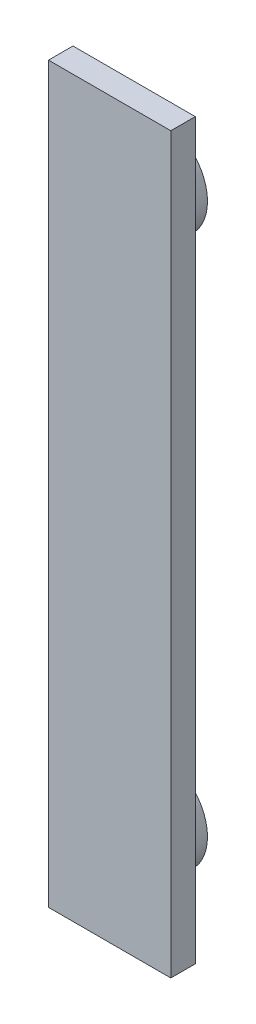
ISO-10303-21;
HEADER;
FILE_DESCRIPTION(('STEP AP214'),'2;1');
FILE_NAME('part.step','',(''),(''),'','','');
FILE_SCHEMA(('AUTOMOTIVE_DESIGN { 1 0 10303 214 1 1 1 1 }'));
ENDSEC;
DATA;
#1=APPLICATION_CONTEXT('core data for automotive mechanical design processes');
#2=APPLICATION_PROTOCOL_DEFINITION('international standard','automotive_design',2000,#1);
#3=PRODUCT_CONTEXT('',#1,'mechanical');
#4=PRODUCT('Part','Part','',(#3));
#5=PRODUCT_RELATED_PRODUCT_CATEGORY('part','',(#4));
#6=PRODUCT_DEFINITION_FORMATION('','',#4);
#7=PRODUCT_DEFINITION_CONTEXT('part definition',#1,'design');
#8=PRODUCT_DEFINITION('design','',#6,#7);
#9=PRODUCT_DEFINITION_SHAPE('','',#8);
#10=(LENGTH_UNIT() NAMED_UNIT(*) SI_UNIT(.MILLI.,.METRE.));
#11=(NAMED_UNIT(*) PLANE_ANGLE_UNIT() SI_UNIT($,.RADIAN.));
#12=(NAMED_UNIT(*) SI_UNIT($,.STERADIAN.) SOLID_ANGLE_UNIT());
#13=UNCERTAINTY_MEASURE_WITH_UNIT(LENGTH_MEASURE(1.E-05),#10,'distance_accuracy_value','');
#14=(GEOMETRIC_REPRESENTATION_CONTEXT(3) GLOBAL_UNCERTAINTY_ASSIGNED_CONTEXT((#13)) GLOBAL_UNIT_ASSIGNED_CONTEXT((#10,
#11,#12)) REPRESENTATION_CONTEXT('',''));
#15=CARTESIAN_POINT('',(0.,0.,0.));
#16=DIRECTION('',(0.,0.,1.));
#17=DIRECTION('',(1.,0.,0.));
#18=AXIS2_PLACEMENT_3D('',#15,#16,#17);
#19=CARTESIAN_POINT('',(-5.,0.,2.));
#20=DIRECTION('',(-1.,0.,0.));
#21=DIRECTION('',(0.,0.,1.));
#22=AXIS2_PLACEMENT_3D('',#19,#20,#21);
#23=PLANE('',#22);
#24=DIRECTION('',(0.,1.,0.));
#25=VECTOR('',#24,1.);
#26=CARTESIAN_POINT('',(-5.,0.,0.));
#27=LINE('',#26,#25);
#28=CARTESIAN_POINT('',(-5.,-30.,0.));
#29=VERTEX_POINT('',#28);
#30=CARTESIAN_POINT('',(-5.,30.,0.));
#31=VERTEX_POINT('',#30);
#32=EDGE_CURVE('E97',#29,#31,#27,.T.);
#33=ORIENTED_EDGE('',*,*,#32,.F.);
#34=DIRECTION('',(0.,0.,-1.));
#35=VECTOR('',#34,1.);
#36=CARTESIAN_POINT('',(-5.,-30.,2.));
#37=LINE('',#36,#35);
#38=CARTESIAN_POINT('',(-5.,-30.,2.));
#39=VERTEX_POINT('',#38);
#40=EDGE_CURVE('E11',#39,#29,#37,.T.);
#41=ORIENTED_EDGE('',*,*,#40,.F.);
#42=DIRECTION('',(0.,1.,0.));
#43=VECTOR('',#42,1.);
#44=CARTESIAN_POINT('',(-5.,0.,2.));
#45=LINE('',#44,#43);
#46=CARTESIAN_POINT('',(-5.,30.,2.));
#47=VERTEX_POINT('',#46);
#48=EDGE_CURVE('E90',#39,#47,#45,.T.);
#49=ORIENTED_EDGE('',*,*,#48,.T.);
#50=DIRECTION('',(0.,0.,-1.));
#51=VECTOR('',#50,1.);
#52=CARTESIAN_POINT('',(-5.,30.,2.));
#53=LINE('',#52,#51);
#54=EDGE_CURVE('E71',#47,#31,#53,.T.);
#55=ORIENTED_EDGE('',*,*,#54,.T.);
#56=EDGE_LOOP('',(#33,#41,#49,#55));
#57=FACE_BOUND('',#56,.T.);
#58=ADVANCED_FACE('F33',(#57),#23,.T.);
#59=CARTESIAN_POINT('',(0.,-30.,2.));
#60=DIRECTION('',(0.,-1.,0.));
#61=DIRECTION('',(0.,0.,-1.));
#62=AXIS2_PLACEMENT_3D('',#59,#60,#61);
#63=PLANE('',#62);
#64=DIRECTION('',(-1.,0.,0.));
#65=VECTOR('',#64,1.);
#66=CARTESIAN_POINT('',(0.,-30.,0.));
#67=LINE('',#66,#65);
#68=CARTESIAN_POINT('',(5.,-30.,0.));
#69=VERTEX_POINT('',#68);
#70=EDGE_CURVE('E84',#69,#29,#67,.T.);
#71=ORIENTED_EDGE('',*,*,#70,.F.);
#72=DIRECTION('',(0.,0.,-1.));
#73=VECTOR('',#72,1.);
#74=CARTESIAN_POINT('',(5.,-30.,2.));
#75=LINE('',#74,#73);
#76=CARTESIAN_POINT('',(5.,-30.,2.));
#77=VERTEX_POINT('',#76);
#78=EDGE_CURVE('E41',#77,#69,#75,.T.);
#79=ORIENTED_EDGE('',*,*,#78,.F.);
#80=DIRECTION('',(-1.,0.,0.));
#81=VECTOR('',#80,1.);
#82=CARTESIAN_POINT('',(0.,-30.,2.));
#83=LINE('',#82,#81);
#84=EDGE_CURVE('E82',#77,#39,#83,.T.);
#85=ORIENTED_EDGE('',*,*,#84,.T.);
#86=ORIENTED_EDGE('',*,*,#40,.T.);
#87=EDGE_LOOP('',(#71,#79,#85,#86));
#88=FACE_BOUND('',#87,.T.);
#89=ADVANCED_FACE('F80',(#88),#63,.T.);
#90=CARTESIAN_POINT('',(5.,0.,2.));
#91=DIRECTION('',(-1.,0.,0.));
#92=DIRECTION('',(0.,0.,1.));
#93=AXIS2_PLACEMENT_3D('',#90,#91,#92);
#94=PLANE('',#93);
#95=DIRECTION('',(0.,1.,0.));
#96=VECTOR('',#95,1.);
#97=CARTESIAN_POINT('',(5.,0.,0.));
#98=LINE('',#97,#96);
#99=CARTESIAN_POINT('',(5.,30.,0.));
#100=VERTEX_POINT('',#99);
#101=EDGE_CURVE('E64',#69,#100,#98,.T.);
#102=ORIENTED_EDGE('',*,*,#101,.T.);
#103=DIRECTION('',(0.,0.,-1.));
#104=VECTOR('',#103,1.);
#105=CARTESIAN_POINT('',(5.,30.,2.));
#106=LINE('',#105,#104);
#107=CARTESIAN_POINT('',(5.,30.,2.));
#108=VERTEX_POINT('',#107);
#109=EDGE_CURVE('E85',#108,#100,#106,.T.);
#110=ORIENTED_EDGE('',*,*,#109,.F.);
#111=DIRECTION('',(0.,1.,0.));
#112=VECTOR('',#111,1.);
#113=CARTESIAN_POINT('',(5.,0.,2.));
#114=LINE('',#113,#112);
#115=EDGE_CURVE('E86',#77,#108,#114,.T.);
#116=ORIENTED_EDGE('',*,*,#115,.F.);
#117=ORIENTED_EDGE('',*,*,#78,.T.);
#118=EDGE_LOOP('',(#102,#110,#116,#117));
#119=FACE_BOUND('',#118,.T.);
#120=ADVANCED_FACE('F87',(#119),#94,.F.);
#121=CARTESIAN_POINT('',(0.,30.,2.));
#122=DIRECTION('',(0.,-1.,0.));
#123=DIRECTION('',(0.,0.,-1.));
#124=AXIS2_PLACEMENT_3D('',#121,#122,#123);
#125=PLANE('',#124);
#126=DIRECTION('',(-1.,0.,0.));
#127=VECTOR('',#126,1.);
#128=CARTESIAN_POINT('',(0.,30.,0.));
#129=LINE('',#128,#127);
#130=EDGE_CURVE('E92',#100,#31,#129,.T.);
#131=ORIENTED_EDGE('',*,*,#130,.T.);
#132=ORIENTED_EDGE('',*,*,#54,.F.);
#133=DIRECTION('',(-1.,0.,0.));
#134=VECTOR('',#133,1.);
#135=CARTESIAN_POINT('',(0.,30.,2.));
#136=LINE('',#135,#134);
#137=EDGE_CURVE('E49',#108,#47,#136,.T.);
#138=ORIENTED_EDGE('',*,*,#137,.F.);
#139=ORIENTED_EDGE('',*,*,#109,.T.);
#140=EDGE_LOOP('',(#131,#132,#138,#139));
#141=FACE_BOUND('',#140,.T.);
#142=ADVANCED_FACE('F107',(#141),#125,.F.);
#143=CARTESIAN_POINT('',(0.,0.,2.));
#144=DIRECTION('',(0.,0.,1.));
#145=DIRECTION('',(1.,0.,0.));
#146=AXIS2_PLACEMENT_3D('',#143,#144,#145);
#147=PLANE('',#146);
#148=ORIENTED_EDGE('',*,*,#48,.F.);
#149=ORIENTED_EDGE('',*,*,#84,.F.);
#150=ORIENTED_EDGE('',*,*,#115,.T.);
#151=ORIENTED_EDGE('',*,*,#137,.T.);
#152=EDGE_LOOP('',(#148,#149,#150,#151));
#153=FACE_BOUND('',#152,.T.);
#154=ADVANCED_FACE('F89',(#153),#147,.T.);
#155=CARTESIAN_POINT('',(0.,0.,0.));
#156=DIRECTION('',(0.,0.,1.));
#157=DIRECTION('',(1.,0.,0.));
#158=AXIS2_PLACEMENT_3D('',#155,#156,#157);
#159=PLANE('',#158);
#160=CARTESIAN_POINT('',(0.,-22.5,0.));
#161=DIRECTION('',(0.,0.,1.));
#162=DIRECTION('',(1.,0.,0.));
#163=AXIS2_PLACEMENT_3D('',#160,#161,#162);
#164=CIRCLE('',#163,4.);
#165=CARTESIAN_POINT('',(4.,-22.5,0.));
#166=VERTEX_POINT('',#165);
#167=EDGE_CURVE('E147',#166,#166,#164,.T.);
#168=ORIENTED_EDGE('',*,*,#167,.T.);
#169=EDGE_LOOP('',(#168));
#170=FACE_BOUND('',#169,.T.);
#171=CARTESIAN_POINT('',(0.,22.5,0.));
#172=DIRECTION('',(0.,0.,1.));
#173=DIRECTION('',(1.,0.,0.));
#174=AXIS2_PLACEMENT_3D('',#171,#172,#173);
#175=CIRCLE('',#174,4.);
#176=CARTESIAN_POINT('',(4.,22.5,0.));
#177=VERTEX_POINT('',#176);
#178=EDGE_CURVE('E146',#177,#177,#175,.T.);
#179=ORIENTED_EDGE('',*,*,#178,.T.);
#180=EDGE_LOOP('',(#179));
#181=FACE_BOUND('',#180,.T.);
#182=ORIENTED_EDGE('',*,*,#32,.T.);
#183=ORIENTED_EDGE('',*,*,#130,.F.);
#184=ORIENTED_EDGE('',*,*,#101,.F.);
#185=ORIENTED_EDGE('',*,*,#70,.T.);
#186=EDGE_LOOP('',(#182,#183,#184,#185));
#187=FACE_BOUND('',#186,.T.);
#188=ADVANCED_FACE('F109',(#170,#181,#187),#159,.F.);
#189=CARTESIAN_POINT('',(0.,22.5,-2.));
#190=DIRECTION('',(0.,0.,1.));
#191=DIRECTION('',(1.,0.,0.));
#192=AXIS2_PLACEMENT_3D('',#189,#190,#191);
#193=CYLINDRICAL_SURFACE('',#192,4.);
#194=CARTESIAN_POINT('',(0.,22.5,-2.));
#195=DIRECTION('',(0.,0.,1.));
#196=DIRECTION('',(1.,0.,0.));
#197=AXIS2_PLACEMENT_3D('',#194,#195,#196);
#198=CIRCLE('',#197,4.);
#199=CARTESIAN_POINT('',(4.,22.5,-2.));
#200=VERTEX_POINT('',#199);
#201=EDGE_CURVE('E100',#200,#200,#198,.T.);
#202=ORIENTED_EDGE('',*,*,#201,.T.);
#203=EDGE_LOOP('',(#202));
#204=FACE_BOUND('',#203,.T.);
#205=ORIENTED_EDGE('',*,*,#178,.F.);
#206=EDGE_LOOP('',(#205));
#207=FACE_BOUND('',#206,.T.);
#208=ADVANCED_FACE('F123',(#204,#207),#193,.T.);
#209=CARTESIAN_POINT('',(0.,0.,-2.));
#210=DIRECTION('',(0.,0.,1.));
#211=DIRECTION('',(1.,0.,0.));
#212=AXIS2_PLACEMENT_3D('',#209,#210,#211);
#213=PLANE('',#212);
#214=ORIENTED_EDGE('',*,*,#201,.F.);
#215=EDGE_LOOP('',(#214));
#216=FACE_BOUND('',#215,.T.);
#217=ADVANCED_FACE('F129',(#216),#213,.F.);
#218=CARTESIAN_POINT('',(0.,-22.5,-2.));
#219=DIRECTION('',(0.,0.,1.));
#220=DIRECTION('',(1.,0.,0.));
#221=AXIS2_PLACEMENT_3D('',#218,#219,#220);
#222=CYLINDRICAL_SURFACE('',#221,4.);
#223=CARTESIAN_POINT('',(0.,-22.5,-2.));
#224=DIRECTION('',(0.,0.,1.));
#225=DIRECTION('',(1.,0.,0.));
#226=AXIS2_PLACEMENT_3D('',#223,#224,#225);
#227=CIRCLE('',#226,4.);
#228=CARTESIAN_POINT('',(4.,-22.5,-2.));
#229=VERTEX_POINT('',#228);
#230=EDGE_CURVE('E145',#229,#229,#227,.T.);
#231=ORIENTED_EDGE('',*,*,#230,.T.);
#232=EDGE_LOOP('',(#231));
#233=FACE_BOUND('',#232,.T.);
#234=ORIENTED_EDGE('',*,*,#167,.F.);
#235=EDGE_LOOP('',(#234));
#236=FACE_BOUND('',#235,.T.);
#237=ADVANCED_FACE('F133',(#233,#236),#222,.T.);
#238=CARTESIAN_POINT('',(0.,0.,-2.));
#239=DIRECTION('',(0.,0.,1.));
#240=DIRECTION('',(1.,0.,0.));
#241=AXIS2_PLACEMENT_3D('',#238,#239,#240);
#242=PLANE('',#241);
#243=ORIENTED_EDGE('',*,*,#230,.F.);
#244=EDGE_LOOP('',(#243));
#245=FACE_BOUND('',#244,.T.);
#246=ADVANCED_FACE('F137',(#245),#242,.F.);
#247=CLOSED_SHELL('',(#58,#89,#120,#142,#154,#188,#208,#217,#237,#246));
#248=MANIFOLD_SOLID_BREP('B2',#247);
#249=ADVANCED_BREP_SHAPE_REPRESENTATION('',(#18,#248),#14);
#250=SHAPE_DEFINITION_REPRESENTATION(#9,#249);
ENDSEC;
END-ISO-10303-21;
